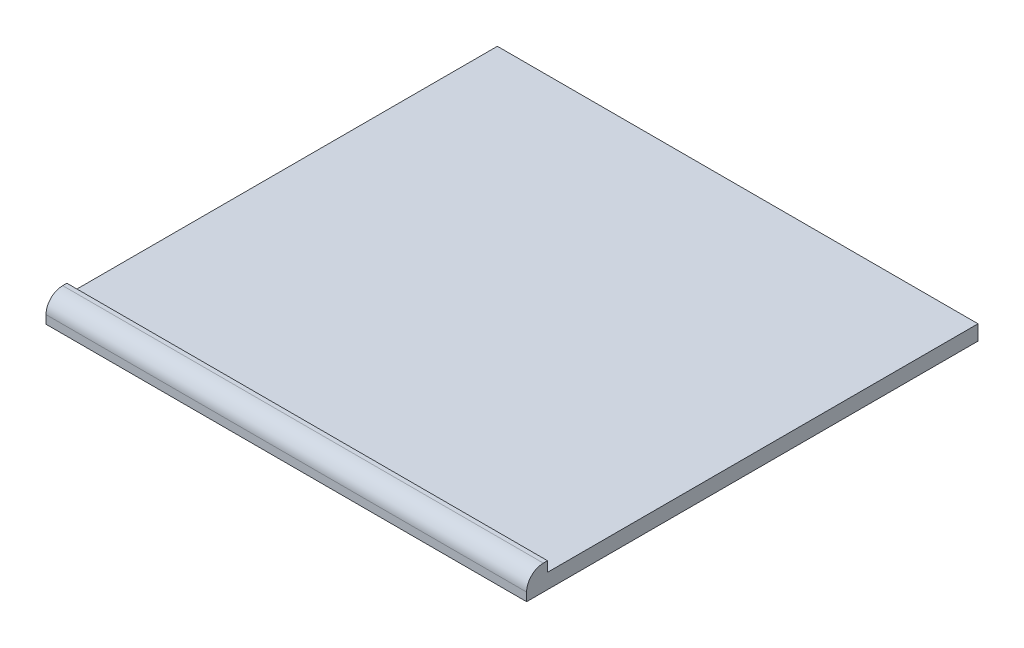
ISO-10303-21;
HEADER;
FILE_DESCRIPTION(('STEP AP214'),'2;1');
FILE_NAME('part.step','',(''),(''),'','','');
FILE_SCHEMA(('AUTOMOTIVE_DESIGN { 1 0 10303 214 1 1 1 1 }'));
ENDSEC;
DATA;
#1=APPLICATION_CONTEXT('core data for automotive mechanical design processes');
#2=APPLICATION_PROTOCOL_DEFINITION('international standard','automotive_design',2000,#1);
#3=PRODUCT_CONTEXT('',#1,'mechanical');
#4=PRODUCT('Part','Part','',(#3));
#5=PRODUCT_RELATED_PRODUCT_CATEGORY('part','',(#4));
#6=PRODUCT_DEFINITION_FORMATION('','',#4);
#7=PRODUCT_DEFINITION_CONTEXT('part definition',#1,'design');
#8=PRODUCT_DEFINITION('design','',#6,#7);
#9=PRODUCT_DEFINITION_SHAPE('','',#8);
#10=(LENGTH_UNIT() NAMED_UNIT(*) SI_UNIT(.MILLI.,.METRE.));
#11=(NAMED_UNIT(*) PLANE_ANGLE_UNIT() SI_UNIT($,.RADIAN.));
#12=(NAMED_UNIT(*) SI_UNIT($,.STERADIAN.) SOLID_ANGLE_UNIT());
#13=UNCERTAINTY_MEASURE_WITH_UNIT(LENGTH_MEASURE(1.E-05),#10,'distance_accuracy_value','');
#14=(GEOMETRIC_REPRESENTATION_CONTEXT(3) GLOBAL_UNCERTAINTY_ASSIGNED_CONTEXT((#13)) GLOBAL_UNIT_ASSIGNED_CONTEXT((#10,
#11,#12)) REPRESENTATION_CONTEXT('',''));
#15=CARTESIAN_POINT('',(0.,0.,0.));
#16=DIRECTION('',(0.,0.,1.));
#17=DIRECTION('',(1.,0.,0.));
#18=AXIS2_PLACEMENT_3D('',#15,#16,#17);
#19=CARTESIAN_POINT('',(0.,1.8,0.));
#20=DIRECTION('',(0.,-1.,0.));
#21=DIRECTION('',(0.,0.,-1.));
#22=AXIS2_PLACEMENT_3D('',#19,#20,#21);
#23=PLANE('',#22);
#24=DIRECTION('',(-1.,0.,0.));
#25=VECTOR('',#24,1.);
#26=CARTESIAN_POINT('',(0.,1.8,-2.5));
#27=LINE('',#26,#25);
#28=CARTESIAN_POINT('',(57.5,1.8,-2.5));
#29=VERTEX_POINT('',#28);
#30=CARTESIAN_POINT('',(0.,1.8,-2.5));
#31=VERTEX_POINT('',#30);
#32=EDGE_CURVE('E128',#29,#31,#27,.T.);
#33=ORIENTED_EDGE('',*,*,#32,.F.);
#34=DIRECTION('',(0.,0.,-1.));
#35=VECTOR('',#34,1.);
#36=CARTESIAN_POINT('',(57.5,1.8,0.));
#37=LINE('',#36,#35);
#38=CARTESIAN_POINT('',(57.5,1.8,-54.));
#39=VERTEX_POINT('',#38);
#40=EDGE_CURVE('E115',#29,#39,#37,.T.);
#41=ORIENTED_EDGE('',*,*,#40,.T.);
#42=DIRECTION('',(-1.,0.,0.));
#43=VECTOR('',#42,1.);
#44=CARTESIAN_POINT('',(0.,1.8,-54.));
#45=LINE('',#44,#43);
#46=CARTESIAN_POINT('',(0.,1.8,-54.));
#47=VERTEX_POINT('',#46);
#48=EDGE_CURVE('E134',#39,#47,#45,.T.);
#49=ORIENTED_EDGE('',*,*,#48,.T.);
#50=DIRECTION('',(0.,0.,1.));
#51=VECTOR('',#50,1.);
#52=CARTESIAN_POINT('',(0.,1.8,0.));
#53=LINE('',#52,#51);
#54=EDGE_CURVE('E130',#47,#31,#53,.T.);
#55=ORIENTED_EDGE('',*,*,#54,.T.);
#56=EDGE_LOOP('',(#33,#41,#49,#55));
#57=FACE_BOUND('',#56,.T.);
#58=ADVANCED_FACE('F43',(#57),#23,.F.);
#59=CARTESIAN_POINT('',(0.,1.8,0.));
#60=DIRECTION('',(1.,0.,0.));
#61=DIRECTION('',(0.,0.,-1.));
#62=AXIS2_PLACEMENT_3D('',#59,#60,#61);
#63=PLANE('',#62);
#64=DIRECTION('',(0.,-1.,0.));
#65=VECTOR('',#64,1.);
#66=CARTESIAN_POINT('',(0.,1.8,0.));
#67=LINE('',#66,#65);
#68=CARTESIAN_POINT('',(0.,1.,0.));
#69=VERTEX_POINT('',#68);
#70=CARTESIAN_POINT('',(0.,0.,0.));
#71=VERTEX_POINT('',#70);
#72=EDGE_CURVE('E152',#69,#71,#67,.T.);
#73=ORIENTED_EDGE('',*,*,#72,.F.);
#74=CARTESIAN_POINT('',(0.,1.,-2.));
#75=DIRECTION('',(1.,0.,0.));
#76=DIRECTION('',(0.,0.,-1.));
#77=AXIS2_PLACEMENT_3D('',#74,#75,#76);
#78=CIRCLE('',#77,2.);
#79=CARTESIAN_POINT('',(0.,3.,-2.));
#80=VERTEX_POINT('',#79);
#81=EDGE_CURVE('E11',#69,#80,#78,.F.);
#82=ORIENTED_EDGE('',*,*,#81,.T.);
#83=DIRECTION('',(0.,0.,1.));
#84=VECTOR('',#83,1.);
#85=CARTESIAN_POINT('',(0.,3.,0.));
#86=LINE('',#85,#84);
#87=CARTESIAN_POINT('',(0.,3.,-2.5));
#88=VERTEX_POINT('',#87);
#89=EDGE_CURVE('E108',#88,#80,#86,.T.);
#90=ORIENTED_EDGE('',*,*,#89,.F.);
#91=DIRECTION('',(0.,-1.,0.));
#92=VECTOR('',#91,1.);
#93=CARTESIAN_POINT('',(0.,3.,-2.5));
#94=LINE('',#93,#92);
#95=EDGE_CURVE('E119',#88,#31,#94,.T.);
#96=ORIENTED_EDGE('',*,*,#95,.T.);
#97=ORIENTED_EDGE('',*,*,#54,.F.);
#98=DIRECTION('',(0.,-1.,0.));
#99=VECTOR('',#98,1.);
#100=CARTESIAN_POINT('',(0.,1.8,-54.));
#101=LINE('',#100,#99);
#102=CARTESIAN_POINT('',(0.,0.,-54.));
#103=VERTEX_POINT('',#102);
#104=EDGE_CURVE('E136',#47,#103,#101,.T.);
#105=ORIENTED_EDGE('',*,*,#104,.T.);
#106=DIRECTION('',(0.,0.,1.));
#107=VECTOR('',#106,1.);
#108=CARTESIAN_POINT('',(0.,0.,0.));
#109=LINE('',#108,#107);
#110=EDGE_CURVE('E118',#103,#71,#109,.T.);
#111=ORIENTED_EDGE('',*,*,#110,.T.);
#112=EDGE_LOOP('',(#73,#82,#90,#96,#97,#105,#111));
#113=FACE_BOUND('',#112,.T.);
#114=ADVANCED_FACE('F164',(#113),#63,.F.);
#115=CARTESIAN_POINT('',(0.,1.8,0.));
#116=DIRECTION('',(0.,0.,-1.));
#117=DIRECTION('',(-1.,0.,0.));
#118=AXIS2_PLACEMENT_3D('',#115,#116,#117);
#119=PLANE('',#118);
#120=DIRECTION('',(0.,-1.,0.));
#121=VECTOR('',#120,1.);
#122=CARTESIAN_POINT('',(57.5,1.8,0.));
#123=LINE('',#122,#121);
#124=CARTESIAN_POINT('',(57.5,1.,0.));
#125=VERTEX_POINT('',#124);
#126=CARTESIAN_POINT('',(57.5,0.,0.));
#127=VERTEX_POINT('',#126);
#128=EDGE_CURVE('E150',#125,#127,#123,.T.);
#129=ORIENTED_EDGE('',*,*,#128,.F.);
#130=DIRECTION('',(1.,0.,0.));
#131=VECTOR('',#130,1.);
#132=CARTESIAN_POINT('',(0.,1.,0.));
#133=LINE('',#132,#131);
#134=EDGE_CURVE('E51',#125,#69,#133,.F.);
#135=ORIENTED_EDGE('',*,*,#134,.T.);
#136=ORIENTED_EDGE('',*,*,#72,.T.);
#137=DIRECTION('',(1.,0.,0.));
#138=VECTOR('',#137,1.);
#139=CARTESIAN_POINT('',(0.,0.,0.));
#140=LINE('',#139,#138);
#141=EDGE_CURVE('E139',#71,#127,#140,.T.);
#142=ORIENTED_EDGE('',*,*,#141,.T.);
#143=EDGE_LOOP('',(#129,#135,#136,#142));
#144=FACE_BOUND('',#143,.T.);
#145=ADVANCED_FACE('F156',(#144),#119,.F.);
#146=CARTESIAN_POINT('',(57.5,1.8,0.));
#147=DIRECTION('',(-1.,0.,0.));
#148=DIRECTION('',(0.,0.,1.));
#149=AXIS2_PLACEMENT_3D('',#146,#147,#148);
#150=PLANE('',#149);
#151=DIRECTION('',(0.,0.,-1.));
#152=VECTOR('',#151,1.);
#153=CARTESIAN_POINT('',(57.5,3.,0.));
#154=LINE('',#153,#152);
#155=CARTESIAN_POINT('',(57.5,3.,-2.));
#156=VERTEX_POINT('',#155);
#157=CARTESIAN_POINT('',(57.5,3.,-2.5));
#158=VERTEX_POINT('',#157);
#159=EDGE_CURVE('E99',#156,#158,#154,.T.);
#160=ORIENTED_EDGE('',*,*,#159,.F.);
#161=CARTESIAN_POINT('',(57.5,1.,-2.));
#162=DIRECTION('',(-1.,0.,0.));
#163=DIRECTION('',(0.,0.,1.));
#164=AXIS2_PLACEMENT_3D('',#161,#162,#163);
#165=CIRCLE('',#164,2.);
#166=EDGE_CURVE('E65',#156,#125,#165,.F.);
#167=ORIENTED_EDGE('',*,*,#166,.T.);
#168=ORIENTED_EDGE('',*,*,#128,.T.);
#169=DIRECTION('',(0.,0.,-1.));
#170=VECTOR('',#169,1.);
#171=CARTESIAN_POINT('',(57.5,0.,0.));
#172=LINE('',#171,#170);
#173=CARTESIAN_POINT('',(57.5,0.,-54.));
#174=VERTEX_POINT('',#173);
#175=EDGE_CURVE('E142',#127,#174,#172,.T.);
#176=ORIENTED_EDGE('',*,*,#175,.T.);
#177=DIRECTION('',(0.,-1.,0.));
#178=VECTOR('',#177,1.);
#179=CARTESIAN_POINT('',(57.5,1.8,-54.));
#180=LINE('',#179,#178);
#181=EDGE_CURVE('E147',#39,#174,#180,.T.);
#182=ORIENTED_EDGE('',*,*,#181,.F.);
#183=ORIENTED_EDGE('',*,*,#40,.F.);
#184=DIRECTION('',(0.,-1.,0.));
#185=VECTOR('',#184,1.);
#186=CARTESIAN_POINT('',(57.5,3.,-2.5));
#187=LINE('',#186,#185);
#188=EDGE_CURVE('E112',#158,#29,#187,.T.);
#189=ORIENTED_EDGE('',*,*,#188,.F.);
#190=EDGE_LOOP('',(#160,#167,#168,#176,#182,#183,#189));
#191=FACE_BOUND('',#190,.T.);
#192=ADVANCED_FACE('F113',(#191),#150,.F.);
#193=CARTESIAN_POINT('',(0.,1.8,-54.));
#194=DIRECTION('',(0.,0.,1.));
#195=DIRECTION('',(1.,0.,0.));
#196=AXIS2_PLACEMENT_3D('',#193,#194,#195);
#197=PLANE('',#196);
#198=DIRECTION('',(-1.,0.,0.));
#199=VECTOR('',#198,1.);
#200=CARTESIAN_POINT('',(0.,0.,-54.));
#201=LINE('',#200,#199);
#202=EDGE_CURVE('E132',#174,#103,#201,.T.);
#203=ORIENTED_EDGE('',*,*,#202,.T.);
#204=ORIENTED_EDGE('',*,*,#104,.F.);
#205=ORIENTED_EDGE('',*,*,#48,.F.);
#206=ORIENTED_EDGE('',*,*,#181,.T.);
#207=EDGE_LOOP('',(#203,#204,#205,#206));
#208=FACE_BOUND('',#207,.T.);
#209=ADVANCED_FACE('F169',(#208),#197,.F.);
#210=CARTESIAN_POINT('',(0.,0.,0.));
#211=DIRECTION('',(0.,-1.,0.));
#212=DIRECTION('',(0.,0.,-1.));
#213=AXIS2_PLACEMENT_3D('',#210,#211,#212);
#214=PLANE('',#213);
#215=ORIENTED_EDGE('',*,*,#110,.F.);
#216=ORIENTED_EDGE('',*,*,#202,.F.);
#217=ORIENTED_EDGE('',*,*,#175,.F.);
#218=ORIENTED_EDGE('',*,*,#141,.F.);
#219=EDGE_LOOP('',(#215,#216,#217,#218));
#220=FACE_BOUND('',#219,.T.);
#221=ADVANCED_FACE('F162',(#220),#214,.T.);
#222=CARTESIAN_POINT('',(0.,3.,-2.5));
#223=DIRECTION('',(0.,0.,1.));
#224=DIRECTION('',(1.,0.,0.));
#225=AXIS2_PLACEMENT_3D('',#222,#223,#224);
#226=PLANE('',#225);
#227=ORIENTED_EDGE('',*,*,#32,.T.);
#228=ORIENTED_EDGE('',*,*,#95,.F.);
#229=DIRECTION('',(-1.,0.,0.));
#230=VECTOR('',#229,1.);
#231=CARTESIAN_POINT('',(0.,3.,-2.5));
#232=LINE('',#231,#230);
#233=EDGE_CURVE('E104',#158,#88,#232,.T.);
#234=ORIENTED_EDGE('',*,*,#233,.F.);
#235=ORIENTED_EDGE('',*,*,#188,.T.);
#236=EDGE_LOOP('',(#227,#228,#234,#235));
#237=FACE_BOUND('',#236,.T.);
#238=ADVANCED_FACE('F121',(#237),#226,.F.);
#239=CARTESIAN_POINT('',(0.,3.,0.));
#240=DIRECTION('',(0.,-1.,0.));
#241=DIRECTION('',(0.,0.,-1.));
#242=AXIS2_PLACEMENT_3D('',#239,#240,#241);
#243=PLANE('',#242);
#244=ORIENTED_EDGE('',*,*,#89,.T.);
#245=DIRECTION('',(1.,0.,0.));
#246=VECTOR('',#245,1.);
#247=CARTESIAN_POINT('',(0.,3.,-2.));
#248=LINE('',#247,#246);
#249=EDGE_CURVE('E107',#80,#156,#248,.T.);
#250=ORIENTED_EDGE('',*,*,#249,.T.);
#251=ORIENTED_EDGE('',*,*,#159,.T.);
#252=ORIENTED_EDGE('',*,*,#233,.T.);
#253=EDGE_LOOP('',(#244,#250,#251,#252));
#254=FACE_BOUND('',#253,.T.);
#255=ADVANCED_FACE('F102',(#254),#243,.F.);
#256=CARTESIAN_POINT('',(0.,1.,-2.));
#257=DIRECTION('',(1.,0.,0.));
#258=DIRECTION('',(0.,0.,-1.));
#259=AXIS2_PLACEMENT_3D('',#256,#257,#258);
#260=CYLINDRICAL_SURFACE('',#259,2.);
#261=ORIENTED_EDGE('',*,*,#81,.F.);
#262=ORIENTED_EDGE('',*,*,#134,.F.);
#263=ORIENTED_EDGE('',*,*,#166,.F.);
#264=ORIENTED_EDGE('',*,*,#249,.F.);
#265=EDGE_LOOP('',(#261,#262,#263,#264));
#266=FACE_BOUND('',#265,.T.);
#267=ADVANCED_FACE('F45',(#266),#260,.T.);
#268=CLOSED_SHELL('',(#58,#114,#145,#192,#209,#221,#238,#255,#267));
#269=MANIFOLD_SOLID_BREP('B2',#268);
#270=ADVANCED_BREP_SHAPE_REPRESENTATION('',(#18,#269),#14);
#271=SHAPE_DEFINITION_REPRESENTATION(#9,#270);
ENDSEC;
END-ISO-10303-21;
